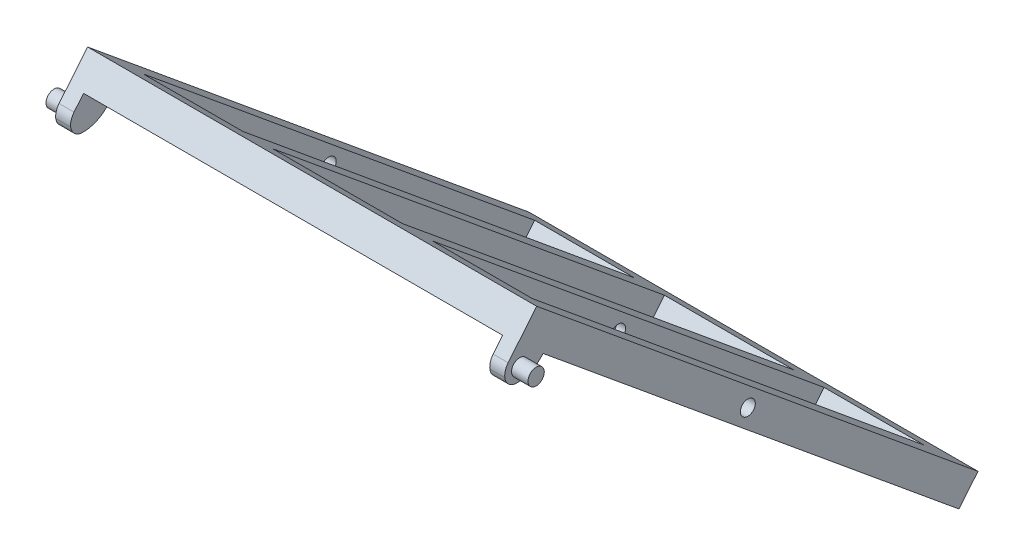
ISO-10303-21;
HEADER;
FILE_DESCRIPTION(('STEP AP214'),'2;1');
FILE_NAME('part.step','',(''),(''),'','','');
FILE_SCHEMA(('AUTOMOTIVE_DESIGN { 1 0 10303 214 1 1 1 1 }'));
ENDSEC;
DATA;
#1=APPLICATION_CONTEXT('core data for automotive mechanical design processes');
#2=APPLICATION_PROTOCOL_DEFINITION('international standard','automotive_design',2000,#1);
#3=PRODUCT_CONTEXT('',#1,'mechanical');
#4=PRODUCT('Part','Part','',(#3));
#5=PRODUCT_RELATED_PRODUCT_CATEGORY('part','',(#4));
#6=PRODUCT_DEFINITION_FORMATION('','',#4);
#7=PRODUCT_DEFINITION_CONTEXT('part definition',#1,'design');
#8=PRODUCT_DEFINITION('design','',#6,#7);
#9=PRODUCT_DEFINITION_SHAPE('','',#8);
#10=(LENGTH_UNIT() NAMED_UNIT(*) SI_UNIT(.MILLI.,.METRE.));
#11=(NAMED_UNIT(*) PLANE_ANGLE_UNIT() SI_UNIT($,.RADIAN.));
#12=(NAMED_UNIT(*) SI_UNIT($,.STERADIAN.) SOLID_ANGLE_UNIT());
#13=UNCERTAINTY_MEASURE_WITH_UNIT(LENGTH_MEASURE(1.E-05),#10,'distance_accuracy_value','');
#14=(GEOMETRIC_REPRESENTATION_CONTEXT(3) GLOBAL_UNCERTAINTY_ASSIGNED_CONTEXT((#13)) GLOBAL_UNIT_ASSIGNED_CONTEXT((#10,
#11,#12)) REPRESENTATION_CONTEXT('',''));
#15=CARTESIAN_POINT('',(0.,0.,0.));
#16=DIRECTION('',(0.,0.,1.));
#17=DIRECTION('',(1.,0.,0.));
#18=AXIS2_PLACEMENT_3D('',#15,#16,#17);
#19=CARTESIAN_POINT('',(-1555.33266545436,1.23088176075692,3828.30962572365));
#20=DIRECTION('',(0.,-0.63589091660457,-0.771778946447621));
#21=DIRECTION('',(0.,0.771778946447621,-0.63589091660457));
#22=AXIS2_PLACEMENT_3D('',#19,#20,#21);
#23=PLANE('',#22);
#24=DIRECTION('',(0.,0.771778946447621,-0.63589091660457));
#25=VECTOR('',#24,1.);
#26=CARTESIAN_POINT('',(-588.632665454366,-1386.77328942589,4971.92626456746));
#27=LINE('',#26,#25);
#28=CARTESIAN_POINT('',(-588.632665454354,-75.947012884002,3891.89871738411));
#29=VERTEX_POINT('',#28);
#30=CARTESIAN_POINT('',(-588.632665454366,1.23088176076047,3828.30962572365));
#31=VERTEX_POINT('',#30);
#32=EDGE_CURVE('E49',#29,#31,#27,.T.);
#33=ORIENTED_EDGE('',*,*,#32,.T.);
#34=DIRECTION('',(1.,0.,0.));
#35=VECTOR('',#34,1.);
#36=CARTESIAN_POINT('',(-1555.33266545436,1.23088176075692,3828.30962572365));
#37=LINE('',#36,#35);
#38=CARTESIAN_POINT('',(-255.332665454363,1.23088176076114,3828.30962572365));
#39=VERTEX_POINT('',#38);
#40=EDGE_CURVE('E222',#31,#39,#37,.T.);
#41=ORIENTED_EDGE('',*,*,#40,.T.);
#42=DIRECTION('',(0.,-0.771778946447621,0.63589091660457));
#43=VECTOR('',#42,1.);
#44=CARTESIAN_POINT('',(-255.332665454363,1.23088176076114,3828.30962572365));
#45=LINE('',#44,#43);
#46=CARTESIAN_POINT('',(-255.332665454363,-75.947012884001,3891.89871738411));
#47=VERTEX_POINT('',#46);
#48=EDGE_CURVE('E538',#39,#47,#45,.T.);
#49=ORIENTED_EDGE('',*,*,#48,.T.);
#50=DIRECTION('',(1.,0.,0.));
#51=VECTOR('',#50,1.);
#52=CARTESIAN_POINT('',(-1555.33266545436,-75.9470128840052,3891.89871738411));
#53=LINE('',#52,#51);
#54=EDGE_CURVE('E527',#29,#47,#53,.T.);
#55=ORIENTED_EDGE('',*,*,#54,.F.);
#56=EDGE_LOOP('',(#33,#41,#49,#55));
#57=FACE_BOUND('',#56,.T.);
#58=ADVANCED_FACE('F34',(#57),#23,.T.);
#59=CARTESIAN_POINT('',(-1555.33266545435,-1076.92306369262,2519.75733412393));
#60=DIRECTION('',(0.,0.63589091660457,0.771778946447621));
#61=DIRECTION('',(0.,-0.771778946447621,0.63589091660457));
#62=AXIS2_PLACEMENT_3D('',#59,#60,#61);
#63=PLANE('',#62);
#64=DIRECTION('',(0.,0.771778946447621,-0.63589091660457));
#65=VECTOR('',#64,1.);
#66=CARTESIAN_POINT('',(-588.632665454354,-2464.92723487927,3663.37397296775));
#67=LINE('',#66,#65);
#68=CARTESIAN_POINT('',(-588.632665454354,-1154.10095833738,2583.3464257844));
#69=VERTEX_POINT('',#68);
#70=CARTESIAN_POINT('',(-588.632665454354,-1076.92306369262,2519.75733412394));
#71=VERTEX_POINT('',#70);
#72=EDGE_CURVE('E204',#69,#71,#67,.T.);
#73=ORIENTED_EDGE('',*,*,#72,.F.);
#74=DIRECTION('',(-1.,0.,0.));
#75=VECTOR('',#74,1.);
#76=CARTESIAN_POINT('',(-1555.33266545435,-1154.10095833738,2583.34642578439));
#77=LINE('',#76,#75);
#78=CARTESIAN_POINT('',(-255.332665454354,-1154.10095833738,2583.34642578439));
#79=VERTEX_POINT('',#78);
#80=EDGE_CURVE('E250',#79,#69,#77,.T.);
#81=ORIENTED_EDGE('',*,*,#80,.F.);
#82=DIRECTION('',(0.,-0.771778946447621,0.63589091660457));
#83=VECTOR('',#82,1.);
#84=CARTESIAN_POINT('',(-255.332665454354,-1076.92306369262,2519.75733412394));
#85=LINE('',#84,#83);
#86=CARTESIAN_POINT('',(-255.332665454354,-1076.92306369262,2519.75733412394));
#87=VERTEX_POINT('',#86);
#88=EDGE_CURVE('E226',#87,#79,#85,.T.);
#89=ORIENTED_EDGE('',*,*,#88,.F.);
#90=DIRECTION('',(-1.,0.,0.));
#91=VECTOR('',#90,1.);
#92=CARTESIAN_POINT('',(-1555.33266545435,-1076.92306369262,2519.75733412393));
#93=LINE('',#92,#91);
#94=EDGE_CURVE('E221',#87,#71,#93,.T.);
#95=ORIENTED_EDGE('',*,*,#94,.T.);
#96=EDGE_LOOP('',(#73,#81,#89,#95));
#97=FACE_BOUND('',#96,.T.);
#98=ADVANCED_FACE('F225',(#97),#63,.T.);
#99=DIRECTION('',(0.,0.771778946447621,-0.63589091660457));
#100=VECTOR('',#99,1.);
#101=CARTESIAN_POINT('',(-1222.03266545437,-1386.77328942589,4971.92626456746));
#102=LINE('',#101,#100);
#103=CARTESIAN_POINT('',(-1222.03266545437,-75.9470128840036,3891.89871738411));
#104=VERTEX_POINT('',#103);
#105=CARTESIAN_POINT('',(-1222.03266545437,1.23088176075759,3828.30962572365));
#106=VERTEX_POINT('',#105);
#107=EDGE_CURVE('E288',#104,#106,#102,.T.);
#108=ORIENTED_EDGE('',*,*,#107,.F.);
#109=CARTESIAN_POINT('',(-1555.33266545436,-75.9470128840052,3891.89871738411));
#110=VERTEX_POINT('',#109);
#111=EDGE_CURVE('E526',#110,#104,#53,.T.);
#112=ORIENTED_EDGE('',*,*,#111,.F.);
#113=DIRECTION('',(0.,-0.771778946447621,0.63589091660457));
#114=VECTOR('',#113,1.);
#115=CARTESIAN_POINT('',(-1555.33266545436,1.23088176075692,3828.30962572365));
#116=LINE('',#115,#114);
#117=CARTESIAN_POINT('',(-1555.33266545436,1.23088176075692,3828.30962572365));
#118=VERTEX_POINT('',#117);
#119=EDGE_CURVE('E541',#118,#110,#116,.T.);
#120=ORIENTED_EDGE('',*,*,#119,.F.);
#121=EDGE_CURVE('E241',#118,#106,#37,.T.);
#122=ORIENTED_EDGE('',*,*,#121,.T.);
#123=EDGE_LOOP('',(#108,#112,#120,#122));
#124=FACE_BOUND('',#123,.T.);
#125=ADVANCED_FACE('F496',(#124),#23,.T.);
#126=DIRECTION('',(0.,0.771778946447621,-0.63589091660457));
#127=VECTOR('',#126,1.);
#128=CARTESIAN_POINT('',(-1222.03266545435,-2464.92723487927,3663.37397296774));
#129=LINE('',#128,#127);
#130=CARTESIAN_POINT('',(-1222.03266545437,-1154.10095833738,2583.34642578439));
#131=VERTEX_POINT('',#130);
#132=CARTESIAN_POINT('',(-1222.03266545435,-1076.92306369262,2519.75733412394));
#133=VERTEX_POINT('',#132);
#134=EDGE_CURVE('E297',#131,#133,#129,.T.);
#135=ORIENTED_EDGE('',*,*,#134,.T.);
#136=CARTESIAN_POINT('',(-1555.33266545435,-1076.92306369262,2519.75733412393));
#137=VERTEX_POINT('',#136);
#138=EDGE_CURVE('E231',#133,#137,#93,.T.);
#139=ORIENTED_EDGE('',*,*,#138,.T.);
#140=DIRECTION('',(0.,-0.771778946447621,0.63589091660457));
#141=VECTOR('',#140,1.);
#142=CARTESIAN_POINT('',(-1555.33266545435,-1076.92306369262,2519.75733412393));
#143=LINE('',#142,#141);
#144=CARTESIAN_POINT('',(-1555.33266545435,-1154.10095833738,2583.34642578439));
#145=VERTEX_POINT('',#144);
#146=EDGE_CURVE('E228',#137,#145,#143,.T.);
#147=ORIENTED_EDGE('',*,*,#146,.T.);
#148=EDGE_CURVE('E534',#131,#145,#77,.T.);
#149=ORIENTED_EDGE('',*,*,#148,.F.);
#150=EDGE_LOOP('',(#135,#139,#147,#149));
#151=FACE_BOUND('',#150,.T.);
#152=ADVANCED_FACE('F502',(#151),#63,.T.);
#153=CARTESIAN_POINT('',(0.,-1955.25360757669,1610.98979758281));
#154=DIRECTION('',(0.,0.771778946447621,-0.63589091660457));
#155=DIRECTION('',(0.,0.63589091660457,0.771778946447621));
#156=AXIS2_PLACEMENT_3D('',#153,#154,#155);
#157=PLANE('',#156);
#158=CARTESIAN_POINT('',(-1122.03266545435,-75.9470128840038,3891.89871738411));
#159=VERTEX_POINT('',#158);
#160=CARTESIAN_POINT('',(-688.632665454366,-75.9470128840014,3891.89871738411));
#161=VERTEX_POINT('',#160);
#162=EDGE_CURVE('E520',#159,#161,#53,.T.);
#163=ORIENTED_EDGE('',*,*,#162,.T.);
#164=DIRECTION('',(0.,-0.63589091660457,-0.771778946447621));
#165=VECTOR('',#164,1.);
#166=CARTESIAN_POINT('',(-688.632665454366,-75.9470128840012,3891.89871738411));
#167=LINE('',#166,#165);
#168=CARTESIAN_POINT('',(-688.632665454366,-1154.10095833738,2583.34642578439));
#169=VERTEX_POINT('',#168);
#170=EDGE_CURVE('E313',#161,#169,#167,.T.);
#171=ORIENTED_EDGE('',*,*,#170,.T.);
#172=CARTESIAN_POINT('',(-1122.03266545435,-1154.10095833738,2583.34642578439));
#173=VERTEX_POINT('',#172);
#174=EDGE_CURVE('E535',#169,#173,#77,.T.);
#175=ORIENTED_EDGE('',*,*,#174,.T.);
#176=DIRECTION('',(0.,0.63589091660457,0.771778946447621));
#177=VECTOR('',#176,1.);
#178=CARTESIAN_POINT('',(-1122.03266545437,-75.9470128840034,3891.89871738411));
#179=LINE('',#178,#177);
#180=EDGE_CURVE('E299',#173,#159,#179,.T.);
#181=ORIENTED_EDGE('',*,*,#180,.T.);
#182=EDGE_LOOP('',(#163,#171,#175,#181));
#183=FACE_BOUND('',#182,.T.);
#184=ORIENTED_EDGE('',*,*,#111,.T.);
#185=DIRECTION('',(0.,-0.63589091660457,-0.771778946447621));
#186=VECTOR('',#185,1.);
#187=CARTESIAN_POINT('',(-1222.03266545437,-75.9470128840036,3891.89871738411));
#188=LINE('',#187,#186);
#189=EDGE_CURVE('E285',#104,#131,#188,.T.);
#190=ORIENTED_EDGE('',*,*,#189,.T.);
#191=ORIENTED_EDGE('',*,*,#148,.T.);
#192=DIRECTION('',(0.,0.63589091660457,0.771778946447621));
#193=VECTOR('',#192,1.);
#194=CARTESIAN_POINT('',(-1555.33266545436,-75.9470128840052,3891.89871738411));
#195=LINE('',#194,#193);
#196=EDGE_CURVE('E254',#145,#110,#195,.T.);
#197=ORIENTED_EDGE('',*,*,#196,.T.);
#198=EDGE_LOOP('',(#184,#190,#191,#197));
#199=FACE_BOUND('',#198,.T.);
#200=DIRECTION('',(0.,0.63589091660457,0.771778946447621));
#201=VECTOR('',#200,1.);
#202=CARTESIAN_POINT('',(-588.632665454366,-75.9470128840007,3891.89871738411));
#203=LINE('',#202,#201);
#204=EDGE_CURVE('E208',#69,#29,#203,.T.);
#205=ORIENTED_EDGE('',*,*,#204,.T.);
#206=ORIENTED_EDGE('',*,*,#54,.T.);
#207=DIRECTION('',(0.,-0.63589091660457,-0.771778946447621));
#208=VECTOR('',#207,1.);
#209=CARTESIAN_POINT('',(-255.332665454363,-75.947012884001,3891.89871738411));
#210=LINE('',#209,#208);
#211=EDGE_CURVE('E530',#47,#79,#210,.T.);
#212=ORIENTED_EDGE('',*,*,#211,.T.);
#213=ORIENTED_EDGE('',*,*,#80,.T.);
#214=EDGE_LOOP('',(#205,#206,#212,#213));
#215=FACE_BOUND('',#214,.T.);
#216=DIRECTION('',(0.,0.63589091660457,0.771778946447621));
#217=VECTOR('',#216,1.);
#218=CARTESIAN_POINT('',(-205.332665454332,-147.041778674199,3805.61120799101));
#219=LINE('',#218,#217);
#220=CARTESIAN_POINT('',(-205.332665454332,-75.9470128840016,3891.8987173841));
#221=VERTEX_POINT('',#220);
#222=CARTESIAN_POINT('',(-205.332665454331,-5.99901205750308,3976.79440149333));
#223=VERTEX_POINT('',#222);
#224=EDGE_CURVE('E272',#221,#223,#219,.T.);
#225=ORIENTED_EDGE('',*,*,#224,.T.);
#226=DIRECTION('',(1.,0.,0.));
#227=VECTOR('',#226,1.);
#228=CARTESIAN_POINT('',(-1655.33266545437,-5.99901205750908,3976.79440149334));
#229=LINE('',#228,#227);
#230=CARTESIAN_POINT('',(-1605.33266545437,-5.99901205750891,3976.79440149334));
#231=VERTEX_POINT('',#230);
#232=EDGE_CURVE('E437',#231,#223,#229,.T.);
#233=ORIENTED_EDGE('',*,*,#232,.F.);
#234=DIRECTION('',(0.,0.63589091660457,0.771778946447621));
#235=VECTOR('',#234,1.);
#236=CARTESIAN_POINT('',(-1605.33266545437,-147.041778674199,3805.61120799101));
#237=LINE('',#236,#235);
#238=CARTESIAN_POINT('',(-1605.33266545436,-75.9470128840063,3891.8987173841));
#239=VERTEX_POINT('',#238);
#240=EDGE_CURVE('E259',#239,#231,#237,.T.);
#241=ORIENTED_EDGE('',*,*,#240,.F.);
#242=DIRECTION('',(-1.,-1.19367772865983E-13,0.));
#243=VECTOR('',#242,1.);
#244=CARTESIAN_POINT('',(-1655.33266545437,-75.9470128840074,3891.8987173841));
#245=LINE('',#244,#243);
#246=CARTESIAN_POINT('',(-1655.33266545436,-75.9470128840063,3891.8987173841));
#247=VERTEX_POINT('',#246);
#248=EDGE_CURVE('E255',#239,#247,#245,.T.);
#249=ORIENTED_EDGE('',*,*,#248,.T.);
#250=DIRECTION('',(0.,0.63589091660457,0.771778946447621));
#251=VECTOR('',#250,1.);
#252=CARTESIAN_POINT('',(-1655.33266545436,-1220.55066277223,2502.69661377839));
#253=LINE('',#252,#251);
#254=CARTESIAN_POINT('',(-1655.33266545436,-1220.55066277223,2502.69661377839));
#255=VERTEX_POINT('',#254);
#256=EDGE_CURVE('E448',#255,#247,#253,.T.);
#257=ORIENTED_EDGE('',*,*,#256,.F.);
#258=DIRECTION('',(-1.,0.,0.));
#259=VECTOR('',#258,1.);
#260=CARTESIAN_POINT('',(-1655.33266545436,-1220.55066277223,2502.69661377839));
#261=LINE('',#260,#259);
#262=CARTESIAN_POINT('',(-155.332665454353,-1220.55066277223,2502.69661377839));
#263=VERTEX_POINT('',#262);
#264=EDGE_CURVE('E436',#263,#255,#261,.T.);
#265=ORIENTED_EDGE('',*,*,#264,.F.);
#266=DIRECTION('',(0.,-0.63589091660457,-0.771778946447621));
#267=VECTOR('',#266,1.);
#268=CARTESIAN_POINT('',(-155.332665454353,-1220.55066277223,2502.69661377839));
#269=LINE('',#268,#267);
#270=CARTESIAN_POINT('',(-155.332665454362,-75.9470128840067,3891.8987173841));
#271=VERTEX_POINT('',#270);
#272=EDGE_CURVE('E430',#271,#263,#269,.T.);
#273=ORIENTED_EDGE('',*,*,#272,.F.);
#274=DIRECTION('',(1.,-1.19367773271786E-13,0.));
#275=VECTOR('',#274,1.);
#276=CARTESIAN_POINT('',(-155.332665454332,-75.9470128840074,3891.8987173841));
#277=LINE('',#276,#275);
#278=EDGE_CURVE('E271',#221,#271,#277,.T.);
#279=ORIENTED_EDGE('',*,*,#278,.F.);
#280=EDGE_LOOP('',(#225,#233,#241,#249,#257,#265,#273,#279));
#281=FACE_BOUND('',#280,.T.);
#282=ADVANCED_FACE('F447',(#183,#199,#215,#281),#157,.F.);
#283=CARTESIAN_POINT('',(0.,-1878.07571293192,1547.40070592236));
#284=DIRECTION('',(0.,0.771778946447621,-0.63589091660457));
#285=DIRECTION('',(0.,0.63589091660457,0.771778946447621));
#286=AXIS2_PLACEMENT_3D('',#283,#284,#285);
#287=PLANE('',#286);
#288=ORIENTED_EDGE('',*,*,#40,.F.);
#289=DIRECTION('',(0.,-0.63589091660457,-0.771778946447621));
#290=VECTOR('',#289,1.);
#291=CARTESIAN_POINT('',(-588.632665454366,1.23088176076047,3828.30962572365));
#292=LINE('',#291,#290);
#293=EDGE_CURVE('E207',#31,#71,#292,.T.);
#294=ORIENTED_EDGE('',*,*,#293,.T.);
#295=ORIENTED_EDGE('',*,*,#94,.F.);
#296=DIRECTION('',(0.,-0.63589091660457,-0.771778946447621));
#297=VECTOR('',#296,1.);
#298=CARTESIAN_POINT('',(-255.332665454363,1.23088176076114,3828.30962572365));
#299=LINE('',#298,#297);
#300=EDGE_CURVE('E236',#39,#87,#299,.T.);
#301=ORIENTED_EDGE('',*,*,#300,.F.);
#302=EDGE_LOOP('',(#288,#294,#295,#301));
#303=FACE_BOUND('',#302,.T.);
#304=CARTESIAN_POINT('',(-1122.03266545437,1.23088176075803,3828.30962572365));
#305=VERTEX_POINT('',#304);
#306=CARTESIAN_POINT('',(-688.632665454366,1.23088176076003,3828.30962572365));
#307=VERTEX_POINT('',#306);
#308=EDGE_CURVE('E245',#305,#307,#37,.T.);
#309=ORIENTED_EDGE('',*,*,#308,.F.);
#310=DIRECTION('',(0.,-0.63589091660457,-0.771778946447621));
#311=VECTOR('',#310,1.);
#312=CARTESIAN_POINT('',(-1122.03266545437,1.23088176075803,3828.30962572365));
#313=LINE('',#312,#311);
#314=CARTESIAN_POINT('',(-1122.03266545435,-1076.92306369262,2519.75733412394));
#315=VERTEX_POINT('',#314);
#316=EDGE_CURVE('E291',#305,#315,#313,.T.);
#317=ORIENTED_EDGE('',*,*,#316,.T.);
#318=CARTESIAN_POINT('',(-688.632665454354,-1076.92306369262,2519.75733412394));
#319=VERTEX_POINT('',#318);
#320=EDGE_CURVE('E229',#319,#315,#93,.T.);
#321=ORIENTED_EDGE('',*,*,#320,.F.);
#322=DIRECTION('',(0.,0.63589091660457,0.771778946447621));
#323=VECTOR('',#322,1.);
#324=CARTESIAN_POINT('',(-688.632665454366,1.23088176076003,3828.30962572365));
#325=LINE('',#324,#323);
#326=EDGE_CURVE('E213',#319,#307,#325,.T.);
#327=ORIENTED_EDGE('',*,*,#326,.T.);
#328=EDGE_LOOP('',(#309,#317,#321,#327));
#329=FACE_BOUND('',#328,.T.);
#330=DIRECTION('',(0.,0.63589091660457,0.771778946447621));
#331=VECTOR('',#330,1.);
#332=CARTESIAN_POINT('',(-1655.33266545436,-1143.37276812747,2439.10752211793));
#333=LINE('',#332,#331);
#334=CARTESIAN_POINT('',(-1655.33266545436,-1143.37276812747,2439.10752211793));
#335=VERTEX_POINT('',#334);
#336=CARTESIAN_POINT('',(-1655.33266545437,71.178882587253,3913.20530983288));
#337=VERTEX_POINT('',#336);
#338=EDGE_CURVE('E449',#335,#337,#333,.T.);
#339=ORIENTED_EDGE('',*,*,#338,.T.);
#340=DIRECTION('',(1.,0.,0.));
#341=VECTOR('',#340,1.);
#342=CARTESIAN_POINT('',(-1655.33266545437,71.178882587253,3913.20530983288));
#343=LINE('',#342,#341);
#344=CARTESIAN_POINT('',(-155.332665454363,71.1788825872581,3913.20530983289));
#345=VERTEX_POINT('',#344);
#346=EDGE_CURVE('E452',#337,#345,#343,.T.);
#347=ORIENTED_EDGE('',*,*,#346,.T.);
#348=DIRECTION('',(0.,-0.63589091660457,-0.771778946447621));
#349=VECTOR('',#348,1.);
#350=CARTESIAN_POINT('',(-155.332665454353,-1143.37276812747,2439.10752211794));
#351=LINE('',#350,#349);
#352=CARTESIAN_POINT('',(-155.332665454353,-1143.37276812747,2439.10752211794));
#353=VERTEX_POINT('',#352);
#354=EDGE_CURVE('E545',#345,#353,#351,.T.);
#355=ORIENTED_EDGE('',*,*,#354,.T.);
#356=DIRECTION('',(-1.,0.,0.));
#357=VECTOR('',#356,1.);
#358=CARTESIAN_POINT('',(-1655.33266545436,-1143.37276812747,2439.10752211793));
#359=LINE('',#358,#357);
#360=EDGE_CURVE('E443',#353,#335,#359,.T.);
#361=ORIENTED_EDGE('',*,*,#360,.T.);
#362=EDGE_LOOP('',(#339,#347,#355,#361));
#363=FACE_BOUND('',#362,.T.);
#364=ORIENTED_EDGE('',*,*,#121,.F.);
#365=DIRECTION('',(0.,0.63589091660457,0.771778946447621));
#366=VECTOR('',#365,1.);
#367=CARTESIAN_POINT('',(-1555.33266545436,1.23088176075692,3828.30962572365));
#368=LINE('',#367,#366);
#369=EDGE_CURVE('E248',#137,#118,#368,.T.);
#370=ORIENTED_EDGE('',*,*,#369,.F.);
#371=ORIENTED_EDGE('',*,*,#138,.F.);
#372=DIRECTION('',(0.,0.63589091660457,0.771778946447621));
#373=VECTOR('',#372,1.);
#374=CARTESIAN_POINT('',(-1222.03266545437,1.23088176075759,3828.30962572365));
#375=LINE('',#374,#373);
#376=EDGE_CURVE('E302',#133,#106,#375,.T.);
#377=ORIENTED_EDGE('',*,*,#376,.T.);
#378=EDGE_LOOP('',(#364,#370,#371,#377));
#379=FACE_BOUND('',#378,.T.);
#380=ADVANCED_FACE('F218',(#303,#329,#363,#379),#287,.T.);
#381=CARTESIAN_POINT('',(-1655.33266545436,-1143.37276812747,2439.10752211793));
#382=DIRECTION('',(1.,0.,0.));
#383=DIRECTION('',(0.,0.,-1.));
#384=AXIS2_PLACEMENT_3D('',#381,#382,#383);
#385=PLANE('',#384);
#386=CARTESIAN_POINT('',(-1655.33266545437,-574.685890092493,3207.95096180563));
#387=DIRECTION('',(1.,0.,0.));
#388=DIRECTION('',(0.,0.,-1.));
#389=AXIS2_PLACEMENT_3D('',#386,#387,#388);
#390=CIRCLE('',#389,25.0000000000005);
#391=CARTESIAN_POINT('',(-1655.33266545437,-574.685890092493,3182.95096180563));
#392=VERTEX_POINT('',#391);
#393=EDGE_CURVE('E333',#392,#392,#390,.F.);
#394=ORIENTED_EDGE('',*,*,#393,.F.);
#395=EDGE_LOOP('',(#394));
#396=FACE_BOUND('',#395,.T.);
#397=CARTESIAN_POINT('',(-1655.33266545437,-76.3825052101136,3970.00000000119));
#398=DIRECTION('',(1.,0.,0.));
#399=DIRECTION('',(0.,0.,-1.));
#400=AXIS2_PLACEMENT_3D('',#397,#398,#399);
#401=CIRCLE('',#400,27.1844999985782);
#402=CARTESIAN_POINT('',(-1655.33266545437,-76.3825052101136,3942.81550000261));
#403=VERTEX_POINT('',#402);
#404=EDGE_CURVE('E360',#403,#403,#401,.F.);
#405=ORIENTED_EDGE('',*,*,#404,.F.);
#406=EDGE_LOOP('',(#405));
#407=FACE_BOUND('',#406,.T.);
#408=CARTESIAN_POINT('',(-1655.33266545437,-7.55832218157994,3978.0791620438));
#409=DIRECTION('',(1.,0.,0.));
#410=DIRECTION('',(0.,0.,-1.));
#411=AXIS2_PLACEMENT_3D('',#408,#409,#410);
#412=CIRCLE('',#411,110.);
#413=CARTESIAN_POINT('',(-1655.33266545437,-77.5063230080827,3893.18347793456));
#414=VERTEX_POINT('',#413);
#415=CARTESIAN_POINT('',(-1655.33266545437,-117.519718806445,3980.99313738842));
#416=VERTEX_POINT('',#415);
#417=EDGE_CURVE('E363',#414,#416,#412,.F.);
#418=ORIENTED_EDGE('',*,*,#417,.T.);
#419=CARTESIAN_POINT('',(-1655.33266545437,-77.5337563974032,3979.93350999038));
#420=DIRECTION('',(1.,0.,0.));
#421=DIRECTION('',(0.,0.,-1.));
#422=AXIS2_PLACEMENT_3D('',#419,#420,#421);
#423=CIRCLE('',#422,40.);
#424=CARTESIAN_POINT('',(-1655.33266545437,-82.1387611461862,4019.66754994687));
#425=VERTEX_POINT('',#424);
#426=EDGE_CURVE('E364',#416,#425,#423,.F.);
#427=ORIENTED_EDGE('',*,*,#426,.T.);
#428=CARTESIAN_POINT('',(-1655.33266545437,-76.3825052102075,3970.00000000126));
#429=DIRECTION('',(1.,0.,0.));
#430=DIRECTION('',(0.,0.,-1.));
#431=AXIS2_PLACEMENT_3D('',#428,#429,#430);
#432=CIRCLE('',#431,50.);
#433=CARTESIAN_POINT('',(-1655.33266545437,-44.5879593799789,4008.58894732364));
#434=VERTEX_POINT('',#433);
#435=EDGE_CURVE('E468',#425,#434,#432,.F.);
#436=ORIENTED_EDGE('',*,*,#435,.T.);
#437=DIRECTION('',(0.,-0.771778946447621,0.63589091660457));
#438=VECTOR('',#437,1.);
#439=CARTESIAN_POINT('',(-1655.33266545437,71.178882587253,3913.20530983288));
#440=LINE('',#439,#438);
#441=EDGE_CURVE('E458',#337,#434,#440,.T.);
#442=ORIENTED_EDGE('',*,*,#441,.F.);
#443=ORIENTED_EDGE('',*,*,#338,.F.);
#444=DIRECTION('',(0.,-0.771778946447621,0.63589091660457));
#445=VECTOR('',#444,1.);
#446=CARTESIAN_POINT('',(-1655.33266545436,-1143.37276812747,2439.10752211793));
#447=LINE('',#446,#445);
#448=EDGE_CURVE('E444',#335,#255,#447,.T.);
#449=ORIENTED_EDGE('',*,*,#448,.T.);
#450=ORIENTED_EDGE('',*,*,#256,.T.);
#451=DIRECTION('',(1.53210777398096E-13,-0.771778946447619,0.635890916604572));
#452=VECTOR('',#451,1.);
#453=CARTESIAN_POINT('',(-1655.33266545437,-75.9470128840072,3891.8987173841));
#454=LINE('',#453,#452);
#455=EDGE_CURVE('E251',#247,#414,#454,.T.);
#456=ORIENTED_EDGE('',*,*,#455,.T.);
#457=EDGE_LOOP('',(#418,#427,#436,#442,#443,#449,#450,#456));
#458=FACE_BOUND('',#457,.T.);
#459=ADVANCED_FACE('F352',(#396,#407,#458),#385,.F.);
#460=CARTESIAN_POINT('',(-1655.33266545437,71.178882587253,3913.20530983288));
#461=DIRECTION('',(0.,-0.63589091660457,-0.771778946447621));
#462=DIRECTION('',(0.,0.771778946447621,-0.63589091660457));
#463=AXIS2_PLACEMENT_3D('',#460,#461,#462);
#464=PLANE('',#463);
#465=DIRECTION('',(1.55431223447344E-13,0.771778946447619,-0.635890916604572));
#466=VECTOR('',#465,1.);
#467=CARTESIAN_POINT('',(-205.332665454331,-5.99901205750308,3976.79440149333));
#468=LINE('',#467,#466);
#469=CARTESIAN_POINT('',(-205.332665454339,-44.5879593799727,4008.58894732363));
#470=VERTEX_POINT('',#469);
#471=EDGE_CURVE('E275',#470,#223,#468,.T.);
#472=ORIENTED_EDGE('',*,*,#471,.F.);
#473=DIRECTION('',(-1.,1.14243213007894E-13,-1.01078325528293E-13));
#474=VECTOR('',#473,1.);
#475=CARTESIAN_POINT('',(-1655.3326654544,-44.5879593798029,4008.58894732349));
#476=LINE('',#475,#474);
#477=CARTESIAN_POINT('',(-155.332665454363,-44.5879593799744,4008.58894732364));
#478=VERTEX_POINT('',#477);
#479=EDGE_CURVE('E385',#470,#478,#476,.F.);
#480=ORIENTED_EDGE('',*,*,#479,.T.);
#481=DIRECTION('',(0.,-0.771778946447621,0.63589091660457));
#482=VECTOR('',#481,1.);
#483=CARTESIAN_POINT('',(-155.332665454363,71.1788825872581,3913.20530983289));
#484=LINE('',#483,#482);
#485=EDGE_CURVE('E416',#345,#478,#484,.T.);
#486=ORIENTED_EDGE('',*,*,#485,.F.);
#487=ORIENTED_EDGE('',*,*,#346,.F.);
#488=ORIENTED_EDGE('',*,*,#441,.T.);
#489=DIRECTION('',(1.,1.21064926316707E-13,0.));
#490=VECTOR('',#489,1.);
#491=CARTESIAN_POINT('',(-1605.33266545436,-44.5879593799732,4008.58894732363));
#492=LINE('',#491,#490);
#493=CARTESIAN_POINT('',(-1605.33266545436,-44.5879593799724,4008.58894732363));
#494=VERTEX_POINT('',#493);
#495=EDGE_CURVE('E462',#434,#494,#492,.T.);
#496=ORIENTED_EDGE('',*,*,#495,.T.);
#497=DIRECTION('',(-1.55431223447344E-13,0.771778946447619,-0.635890916604572));
#498=VECTOR('',#497,1.);
#499=CARTESIAN_POINT('',(-1605.33266545437,-5.99901205750308,3976.79440149333));
#500=LINE('',#499,#498);
#501=EDGE_CURVE('E262',#494,#231,#500,.T.);
#502=ORIENTED_EDGE('',*,*,#501,.T.);
#503=ORIENTED_EDGE('',*,*,#232,.T.);
#504=EDGE_LOOP('',(#472,#480,#486,#487,#488,#496,#502,#503));
#505=FACE_BOUND('',#504,.T.);
#506=ADVANCED_FACE('F355',(#505),#464,.F.);
#507=CARTESIAN_POINT('',(-155.332665454353,-1143.37276812747,2439.10752211794));
#508=DIRECTION('',(-1.,0.,0.));
#509=DIRECTION('',(0.,0.,1.));
#510=AXIS2_PLACEMENT_3D('',#507,#508,#509);
#511=PLANE('',#510);
#512=CARTESIAN_POINT('',(-155.332665454358,-574.685890092493,3207.95096180563));
#513=DIRECTION('',(-1.,0.,0.));
#514=DIRECTION('',(0.,0.,1.));
#515=AXIS2_PLACEMENT_3D('',#512,#513,#514);
#516=CIRCLE('',#515,25.0000000000005);
#517=CARTESIAN_POINT('',(-155.332665454358,-574.685890092493,3232.95096180563));
#518=VERTEX_POINT('',#517);
#519=EDGE_CURVE('E321',#518,#518,#516,.T.);
#520=ORIENTED_EDGE('',*,*,#519,.T.);
#521=EDGE_LOOP('',(#520));
#522=FACE_BOUND('',#521,.T.);
#523=CARTESIAN_POINT('',(-155.332665454347,-76.3825052101136,3970.00000000119));
#524=DIRECTION('',(-1.,0.,0.));
#525=DIRECTION('',(0.,0.,1.));
#526=AXIS2_PLACEMENT_3D('',#523,#524,#525);
#527=CIRCLE('',#526,27.1844999985782);
#528=CARTESIAN_POINT('',(-155.332665454347,-76.3825052101136,3997.18449999977));
#529=VERTEX_POINT('',#528);
#530=EDGE_CURVE('E282',#529,#529,#527,.T.);
#531=ORIENTED_EDGE('',*,*,#530,.T.);
#532=EDGE_LOOP('',(#531));
#533=FACE_BOUND('',#532,.T.);
#534=CARTESIAN_POINT('',(-155.332665454362,-76.3825052102024,3970.00000000126));
#535=DIRECTION('',(-1.,0.,0.));
#536=DIRECTION('',(0.,0.,1.));
#537=AXIS2_PLACEMENT_3D('',#534,#535,#536);
#538=CIRCLE('',#537,50.);
#539=CARTESIAN_POINT('',(-155.332665454363,-82.1387611461898,4019.66754994687));
#540=VERTEX_POINT('',#539);
#541=EDGE_CURVE('E387',#478,#540,#538,.F.);
#542=ORIENTED_EDGE('',*,*,#541,.T.);
#543=CARTESIAN_POINT('',(-155.332665454362,-77.5337563973999,3979.93350999039));
#544=DIRECTION('',(-1.,0.,0.));
#545=DIRECTION('',(0.,0.,1.));
#546=AXIS2_PLACEMENT_3D('',#543,#544,#545);
#547=CIRCLE('',#546,40.);
#548=CARTESIAN_POINT('',(-155.332665454362,-117.519718806442,3980.99313738844));
#549=VERTEX_POINT('',#548);
#550=EDGE_CURVE('E11',#540,#549,#547,.F.);
#551=ORIENTED_EDGE('',*,*,#550,.T.);
#552=CARTESIAN_POINT('',(-155.332665454363,-7.55832218157677,3978.0791620438));
#553=DIRECTION('',(-1.,0.,0.));
#554=DIRECTION('',(0.,0.,1.));
#555=AXIS2_PLACEMENT_3D('',#552,#553,#554);
#556=CIRCLE('',#555,110.);
#557=CARTESIAN_POINT('',(-155.332665454362,-77.5063230080795,3893.18347793456));
#558=VERTEX_POINT('',#557);
#559=EDGE_CURVE('E396',#549,#558,#556,.F.);
#560=ORIENTED_EDGE('',*,*,#559,.T.);
#561=DIRECTION('',(-1.53210777398096E-13,-0.771778946447619,0.635890916604572));
#562=VECTOR('',#561,1.);
#563=CARTESIAN_POINT('',(-155.332665454332,-75.9470128840072,3891.8987173841));
#564=LINE('',#563,#562);
#565=EDGE_CURVE('E268',#271,#558,#564,.T.);
#566=ORIENTED_EDGE('',*,*,#565,.F.);
#567=ORIENTED_EDGE('',*,*,#272,.T.);
#568=DIRECTION('',(0.,-0.771778946447621,0.63589091660457));
#569=VECTOR('',#568,1.);
#570=CARTESIAN_POINT('',(-155.332665454353,-1143.37276812747,2439.10752211794));
#571=LINE('',#570,#569);
#572=EDGE_CURVE('E432',#353,#263,#571,.T.);
#573=ORIENTED_EDGE('',*,*,#572,.F.);
#574=ORIENTED_EDGE('',*,*,#354,.F.);
#575=ORIENTED_EDGE('',*,*,#485,.T.);
#576=EDGE_LOOP('',(#542,#551,#560,#566,#567,#573,#574,#575));
#577=FACE_BOUND('',#576,.T.);
#578=ADVANCED_FACE('F412',(#522,#533,#577),#511,.F.);
#579=CARTESIAN_POINT('',(-1655.33266545436,-1143.37276812747,2439.10752211793));
#580=DIRECTION('',(0.,0.63589091660457,0.771778946447621));
#581=DIRECTION('',(0.,-0.771778946447621,0.63589091660457));
#582=AXIS2_PLACEMENT_3D('',#579,#580,#581);
#583=PLANE('',#582);
#584=ORIENTED_EDGE('',*,*,#264,.T.);
#585=ORIENTED_EDGE('',*,*,#448,.F.);
#586=ORIENTED_EDGE('',*,*,#360,.F.);
#587=ORIENTED_EDGE('',*,*,#572,.T.);
#588=EDGE_LOOP('',(#584,#585,#586,#587));
#589=FACE_BOUND('',#588,.T.);
#590=ADVANCED_FACE('F440',(#589),#583,.F.);
#591=CARTESIAN_POINT('',(-1555.33266545436,1.23088176075692,3828.30962572365));
#592=DIRECTION('',(1.,0.,0.));
#593=DIRECTION('',(0.,0.,-1.));
#594=AXIS2_PLACEMENT_3D('',#591,#592,#593);
#595=PLANE('',#594);
#596=CARTESIAN_POINT('',(-1555.33266545436,-574.685890092493,3207.95096180563));
#597=DIRECTION('',(-1.,0.,0.));
#598=DIRECTION('',(0.,0.,1.));
#599=AXIS2_PLACEMENT_3D('',#596,#597,#598);
#600=CIRCLE('',#599,25.0000000000005);
#601=CARTESIAN_POINT('',(-1555.33266545436,-574.685890092493,3232.95096180563));
#602=VERTEX_POINT('',#601);
#603=EDGE_CURVE('E338',#602,#602,#600,.T.);
#604=ORIENTED_EDGE('',*,*,#603,.T.);
#605=EDGE_LOOP('',(#604));
#606=FACE_BOUND('',#605,.T.);
#607=ORIENTED_EDGE('',*,*,#196,.F.);
#608=ORIENTED_EDGE('',*,*,#146,.F.);
#609=ORIENTED_EDGE('',*,*,#369,.T.);
#610=ORIENTED_EDGE('',*,*,#119,.T.);
#611=EDGE_LOOP('',(#607,#608,#609,#610));
#612=FACE_BOUND('',#611,.T.);
#613=ADVANCED_FACE('F342',(#606,#612),#595,.T.);
#614=DIRECTION('',(0.,0.771778946447621,-0.63589091660457));
#615=VECTOR('',#614,1.);
#616=CARTESIAN_POINT('',(-688.632665454366,-1386.77328942589,4971.92626456746));
#617=LINE('',#616,#615);
#618=EDGE_CURVE('E310',#161,#307,#617,.T.);
#619=ORIENTED_EDGE('',*,*,#618,.F.);
#620=ORIENTED_EDGE('',*,*,#162,.F.);
#621=DIRECTION('',(0.,0.771778946447621,-0.63589091660457));
#622=VECTOR('',#621,1.);
#623=CARTESIAN_POINT('',(-1122.03266545437,-1386.77328942589,4971.92626456746));
#624=LINE('',#623,#622);
#625=EDGE_CURVE('E290',#159,#305,#624,.T.);
#626=ORIENTED_EDGE('',*,*,#625,.T.);
#627=ORIENTED_EDGE('',*,*,#308,.T.);
#628=EDGE_LOOP('',(#619,#620,#626,#627));
#629=FACE_BOUND('',#628,.T.);
#630=ADVANCED_FACE('F497',(#629),#23,.T.);
#631=CARTESIAN_POINT('',(-255.332665454363,1.23088176076114,3828.30962572365));
#632=DIRECTION('',(-1.,0.,0.));
#633=DIRECTION('',(0.,0.,1.));
#634=AXIS2_PLACEMENT_3D('',#631,#632,#633);
#635=PLANE('',#634);
#636=CARTESIAN_POINT('',(-255.332665454347,-574.685890092493,3207.95096180563));
#637=DIRECTION('',(-1.,0.,0.));
#638=DIRECTION('',(0.,0.,1.));
#639=AXIS2_PLACEMENT_3D('',#636,#637,#638);
#640=CIRCLE('',#639,25.0000000000005);
#641=CARTESIAN_POINT('',(-255.332665454347,-574.685890092493,3232.95096180563));
#642=VERTEX_POINT('',#641);
#643=EDGE_CURVE('E326',#642,#642,#640,.T.);
#644=ORIENTED_EDGE('',*,*,#643,.F.);
#645=EDGE_LOOP('',(#644));
#646=FACE_BOUND('',#645,.T.);
#647=ORIENTED_EDGE('',*,*,#211,.F.);
#648=ORIENTED_EDGE('',*,*,#48,.F.);
#649=ORIENTED_EDGE('',*,*,#300,.T.);
#650=ORIENTED_EDGE('',*,*,#88,.T.);
#651=EDGE_LOOP('',(#647,#648,#649,#650));
#652=FACE_BOUND('',#651,.T.);
#653=ADVANCED_FACE('F509',(#646,#652),#635,.T.);
#654=DIRECTION('',(0.,0.771778946447621,-0.63589091660457));
#655=VECTOR('',#654,1.);
#656=CARTESIAN_POINT('',(-688.632665454354,-2464.92723487927,3663.37397296775));
#657=LINE('',#656,#655);
#658=EDGE_CURVE('E57',#169,#319,#657,.T.);
#659=ORIENTED_EDGE('',*,*,#658,.T.);
#660=ORIENTED_EDGE('',*,*,#320,.T.);
#661=DIRECTION('',(0.,0.771778946447621,-0.63589091660457));
#662=VECTOR('',#661,1.);
#663=CARTESIAN_POINT('',(-1122.03266545435,-2464.92723487927,3663.37397296774));
#664=LINE('',#663,#662);
#665=EDGE_CURVE('E294',#173,#315,#664,.T.);
#666=ORIENTED_EDGE('',*,*,#665,.F.);
#667=ORIENTED_EDGE('',*,*,#174,.F.);
#668=EDGE_LOOP('',(#659,#660,#666,#667));
#669=FACE_BOUND('',#668,.T.);
#670=ADVANCED_FACE('F503',(#669),#63,.T.);
#671=CARTESIAN_POINT('',(-1605.33266545437,-147.041778674199,3805.61120799101));
#672=DIRECTION('',(1.,1.23369402531662E-13,0.));
#673=DIRECTION('',(-1.23369402531662E-13,1.,0.));
#674=AXIS2_PLACEMENT_3D('',#671,#672,#673);
#675=PLANE('',#674);
#676=CARTESIAN_POINT('',(-1605.33266545436,-76.3825052102014,3970.00000000125));
#677=DIRECTION('',(1.,1.23369402531662E-13,0.));
#678=DIRECTION('',(-1.23369402531662E-13,1.,0.));
#679=AXIS2_PLACEMENT_3D('',#676,#677,#678);
#680=CIRCLE('',#679,50.);
#681=CARTESIAN_POINT('',(-1605.33266545436,-82.1387611461802,4019.66754994686));
#682=VERTEX_POINT('',#681);
#683=EDGE_CURVE('E465',#494,#682,#680,.T.);
#684=ORIENTED_EDGE('',*,*,#683,.T.);
#685=CARTESIAN_POINT('',(-1605.33266545436,-77.5337563973972,3979.93350999037));
#686=DIRECTION('',(1.,1.23369402531662E-13,0.));
#687=DIRECTION('',(-1.23369402531662E-13,1.,0.));
#688=AXIS2_PLACEMENT_3D('',#685,#686,#687);
#689=CIRCLE('',#688,40.);
#690=CARTESIAN_POINT('',(-1605.33266545436,-117.519718806439,3980.99313738842));
#691=VERTEX_POINT('',#690);
#692=EDGE_CURVE('E381',#682,#691,#689,.T.);
#693=ORIENTED_EDGE('',*,*,#692,.T.);
#694=CARTESIAN_POINT('',(-1605.33266545437,-7.55832218157388,3978.07916204379));
#695=DIRECTION('',(1.,1.23369402531662E-13,0.));
#696=DIRECTION('',(-1.23369402531662E-13,1.,0.));
#697=AXIS2_PLACEMENT_3D('',#694,#695,#696);
#698=CIRCLE('',#697,110.);
#699=CARTESIAN_POINT('',(-1605.33266545437,-77.5063230080767,3893.18347793456));
#700=VERTEX_POINT('',#699);
#701=EDGE_CURVE('E374',#691,#700,#698,.T.);
#702=ORIENTED_EDGE('',*,*,#701,.T.);
#703=DIRECTION('',(-1.55431223447344E-13,0.771778946447619,-0.635890916604572));
#704=VECTOR('',#703,1.);
#705=CARTESIAN_POINT('',(-1605.33266545437,-75.9470128840012,3891.8987173841));
#706=LINE('',#705,#704);
#707=EDGE_CURVE('E258',#700,#239,#706,.T.);
#708=ORIENTED_EDGE('',*,*,#707,.T.);
#709=ORIENTED_EDGE('',*,*,#240,.T.);
#710=ORIENTED_EDGE('',*,*,#501,.F.);
#711=EDGE_LOOP('',(#684,#693,#702,#708,#709,#710));
#712=FACE_BOUND('',#711,.T.);
#713=ADVANCED_FACE('F472',(#712),#675,.T.);
#714=CARTESIAN_POINT('',(-1655.33266545436,-153.124907528768,3955.48780904456));
#715=DIRECTION('',(0.,-0.635890916604572,-0.771778946447619));
#716=DIRECTION('',(0.,0.771778946447619,-0.635890916604572));
#717=AXIS2_PLACEMENT_3D('',#714,#715,#716);
#718=PLANE('',#717);
#719=ORIENTED_EDGE('',*,*,#707,.F.);
#720=DIRECTION('',(-1.,-1.17654069459399E-13,0.));
#721=VECTOR('',#720,1.);
#722=CARTESIAN_POINT('',(-1655.33266545438,-77.5063230080827,3893.18347793456));
#723=LINE('',#722,#721);
#724=EDGE_CURVE('E371',#700,#414,#723,.T.);
#725=ORIENTED_EDGE('',*,*,#724,.T.);
#726=ORIENTED_EDGE('',*,*,#455,.F.);
#727=ORIENTED_EDGE('',*,*,#248,.F.);
#728=EDGE_LOOP('',(#719,#725,#726,#727));
#729=FACE_BOUND('',#728,.T.);
#730=ADVANCED_FACE('F477',(#729),#718,.T.);
#731=CARTESIAN_POINT('',(-1710.33266545436,-76.3825052101136,3970.00000000119));
#732=DIRECTION('',(1.,0.,0.));
#733=DIRECTION('',(0.,0.,-1.));
#734=AXIS2_PLACEMENT_3D('',#731,#732,#733);
#735=CYLINDRICAL_SURFACE('',#734,27.1844999985782);
#736=CARTESIAN_POINT('',(-1710.33266545436,-76.3825052101136,3970.00000000119));
#737=DIRECTION('',(-1.,0.,0.));
#738=DIRECTION('',(0.,0.,1.));
#739=AXIS2_PLACEMENT_3D('',#736,#737,#738);
#740=CIRCLE('',#739,27.1844999985782);
#741=CARTESIAN_POINT('',(-1710.33266545436,-76.3825052101136,3997.18449999977));
#742=VERTEX_POINT('',#741);
#743=EDGE_CURVE('E264',#742,#742,#740,.T.);
#744=ORIENTED_EDGE('',*,*,#743,.F.);
#745=EDGE_LOOP('',(#744));
#746=FACE_BOUND('',#745,.T.);
#747=ORIENTED_EDGE('',*,*,#404,.T.);
#748=EDGE_LOOP('',(#747));
#749=FACE_BOUND('',#748,.T.);
#750=ADVANCED_FACE('F692',(#746,#749),#735,.T.);
#751=CARTESIAN_POINT('',(-1710.33266545436,-76.3825052101136,3970.00000000119));
#752=DIRECTION('',(-1.,0.,0.));
#753=DIRECTION('',(0.,0.,1.));
#754=AXIS2_PLACEMENT_3D('',#751,#752,#753);
#755=PLANE('',#754);
#756=ORIENTED_EDGE('',*,*,#743,.T.);
#757=EDGE_LOOP('',(#756));
#758=FACE_BOUND('',#757,.T.);
#759=ADVANCED_FACE('F490',(#758),#755,.T.);
#760=CARTESIAN_POINT('',(-1655.33266545435,-76.3825052102075,3970.00000000126));
#761=DIRECTION('',(-1.,-1.21064926316707E-13,0.));
#762=DIRECTION('',(1.21064926316707E-13,-1.,0.));
#763=AXIS2_PLACEMENT_3D('',#760,#761,#762);
#764=CYLINDRICAL_SURFACE('',#763,50.);
#765=ORIENTED_EDGE('',*,*,#435,.F.);
#766=DIRECTION('',(-1.,-1.21064926316707E-13,0.));
#767=VECTOR('',#766,1.);
#768=CARTESIAN_POINT('',(-1655.33266545434,-82.1387611461862,4019.66754994687));
#769=LINE('',#768,#767);
#770=EDGE_CURVE('E379',#425,#682,#769,.F.);
#771=ORIENTED_EDGE('',*,*,#770,.T.);
#772=ORIENTED_EDGE('',*,*,#683,.F.);
#773=ORIENTED_EDGE('',*,*,#495,.F.);
#774=EDGE_LOOP('',(#765,#771,#772,#773));
#775=FACE_BOUND('',#774,.T.);
#776=ADVANCED_FACE('F482',(#775),#764,.T.);
#777=CARTESIAN_POINT('',(-1655.33266545437,-7.55832218157994,3978.0791620438));
#778=DIRECTION('',(1.,1.21064926316707E-13,0.));
#779=DIRECTION('',(-1.21064926316707E-13,1.,0.));
#780=AXIS2_PLACEMENT_3D('',#777,#778,#779);
#781=CYLINDRICAL_SURFACE('',#780,110.);
#782=ORIENTED_EDGE('',*,*,#701,.F.);
#783=DIRECTION('',(1.,1.21064926316707E-13,0.));
#784=VECTOR('',#783,1.);
#785=CARTESIAN_POINT('',(-1655.33266545436,-117.519718806445,3980.99313738842));
#786=LINE('',#785,#784);
#787=EDGE_CURVE('E370',#691,#416,#786,.F.);
#788=ORIENTED_EDGE('',*,*,#787,.T.);
#789=ORIENTED_EDGE('',*,*,#417,.F.);
#790=ORIENTED_EDGE('',*,*,#724,.F.);
#791=EDGE_LOOP('',(#782,#788,#789,#790));
#792=FACE_BOUND('',#791,.T.);
#793=ADVANCED_FACE('F479',(#792),#781,.T.);
#794=CARTESIAN_POINT('',(-1655.33266545435,-77.5337563974032,3979.93350999038));
#795=DIRECTION('',(-1.,-1.21064926316707E-13,0.));
#796=DIRECTION('',(1.21064926316707E-13,-1.,0.));
#797=AXIS2_PLACEMENT_3D('',#794,#795,#796);
#798=CYLINDRICAL_SURFACE('',#797,40.);
#799=ORIENTED_EDGE('',*,*,#692,.F.);
#800=ORIENTED_EDGE('',*,*,#770,.F.);
#801=ORIENTED_EDGE('',*,*,#426,.F.);
#802=ORIENTED_EDGE('',*,*,#787,.F.);
#803=EDGE_LOOP('',(#799,#800,#801,#802));
#804=FACE_BOUND('',#803,.T.);
#805=ADVANCED_FACE('F481',(#804),#798,.T.);
#806=CARTESIAN_POINT('',(-205.332665454332,-147.041778674199,3805.61120799101));
#807=DIRECTION('',(1.,-1.23369402531662E-13,0.));
#808=DIRECTION('',(1.23369402531662E-13,1.,0.));
#809=AXIS2_PLACEMENT_3D('',#806,#807,#808);
#810=PLANE('',#809);
#811=CARTESIAN_POINT('',(-205.332665454331,-7.55832218157106,3978.07916204379));
#812=DIRECTION('',(1.,-1.23369402531662E-13,0.));
#813=DIRECTION('',(1.23369402531662E-13,1.,0.));
#814=AXIS2_PLACEMENT_3D('',#811,#812,#813);
#815=CIRCLE('',#814,110.);
#816=CARTESIAN_POINT('',(-205.332665454332,-77.5063230080737,3893.18347793455));
#817=VERTEX_POINT('',#816);
#818=CARTESIAN_POINT('',(-205.332665454345,-117.519718806436,3980.99313738843));
#819=VERTEX_POINT('',#818);
#820=EDGE_CURVE('E393',#817,#819,#815,.F.);
#821=ORIENTED_EDGE('',*,*,#820,.T.);
#822=CARTESIAN_POINT('',(-205.33266545434,-77.5337563973941,3979.93350999038));
#823=DIRECTION('',(1.,-1.23369402531662E-13,0.));
#824=DIRECTION('',(1.23369402531662E-13,1.,0.));
#825=AXIS2_PLACEMENT_3D('',#822,#823,#824);
#826=CIRCLE('',#825,40.);
#827=CARTESIAN_POINT('',(-205.332665454344,-82.1387611461842,4019.66754994687));
#828=VERTEX_POINT('',#827);
#829=EDGE_CURVE('E401',#819,#828,#826,.F.);
#830=ORIENTED_EDGE('',*,*,#829,.T.);
#831=CARTESIAN_POINT('',(-205.332665454339,-76.3825052101967,3970.00000000126));
#832=DIRECTION('',(1.,-1.23369402531662E-13,0.));
#833=DIRECTION('',(1.23369402531662E-13,1.,0.));
#834=AXIS2_PLACEMENT_3D('',#831,#832,#833);
#835=CIRCLE('',#834,50.);
#836=EDGE_CURVE('E383',#828,#470,#835,.F.);
#837=ORIENTED_EDGE('',*,*,#836,.T.);
#838=ORIENTED_EDGE('',*,*,#471,.T.);
#839=ORIENTED_EDGE('',*,*,#224,.F.);
#840=DIRECTION('',(1.55431223447344E-13,0.771778946447619,-0.635890916604572));
#841=VECTOR('',#840,1.);
#842=CARTESIAN_POINT('',(-205.332665454332,-75.9470128840012,3891.8987173841));
#843=LINE('',#842,#841);
#844=EDGE_CURVE('E269',#817,#221,#843,.T.);
#845=ORIENTED_EDGE('',*,*,#844,.F.);
#846=EDGE_LOOP('',(#821,#830,#837,#838,#839,#845));
#847=FACE_BOUND('',#846,.T.);
#848=ADVANCED_FACE('F423',(#847),#810,.F.);
#849=CARTESIAN_POINT('',(-1655.33266545436,-153.124907528768,3955.48780904456));
#850=DIRECTION('',(0.,-0.635890916604572,-0.771778946447619));
#851=DIRECTION('',(0.,0.771778946447619,-0.635890916604572));
#852=AXIS2_PLACEMENT_3D('',#849,#850,#851);
#853=PLANE('',#852);
#854=ORIENTED_EDGE('',*,*,#565,.T.);
#855=DIRECTION('',(1.,-1.17654069865202E-13,0.));
#856=VECTOR('',#855,1.);
#857=CARTESIAN_POINT('',(-205.332665454333,-77.5063230080737,3893.18347793455));
#858=LINE('',#857,#856);
#859=EDGE_CURVE('E390',#558,#817,#858,.F.);
#860=ORIENTED_EDGE('',*,*,#859,.T.);
#861=ORIENTED_EDGE('',*,*,#844,.T.);
#862=ORIENTED_EDGE('',*,*,#278,.T.);
#863=EDGE_LOOP('',(#854,#860,#861,#862));
#864=FACE_BOUND('',#863,.T.);
#865=ADVANCED_FACE('F427',(#864),#853,.T.);
#866=CARTESIAN_POINT('',(-100.332665454347,-76.3825052101136,3970.00000000119));
#867=DIRECTION('',(-1.,0.,0.));
#868=DIRECTION('',(0.,0.,1.));
#869=AXIS2_PLACEMENT_3D('',#866,#867,#868);
#870=CYLINDRICAL_SURFACE('',#869,27.1844999985782);
#871=CARTESIAN_POINT('',(-100.332665454347,-76.3825052101136,3970.00000000119));
#872=DIRECTION('',(-1.,0.,0.));
#873=DIRECTION('',(0.,0.,1.));
#874=AXIS2_PLACEMENT_3D('',#871,#872,#873);
#875=CIRCLE('',#874,27.1844999985782);
#876=CARTESIAN_POINT('',(-100.332665454347,-76.3825052101136,3997.18449999977));
#877=VERTEX_POINT('',#876);
#878=EDGE_CURVE('E279',#877,#877,#875,.T.);
#879=ORIENTED_EDGE('',*,*,#878,.T.);
#880=EDGE_LOOP('',(#879));
#881=FACE_BOUND('',#880,.T.);
#882=ORIENTED_EDGE('',*,*,#530,.F.);
#883=EDGE_LOOP('',(#882));
#884=FACE_BOUND('',#883,.T.);
#885=ADVANCED_FACE('F681',(#881,#884),#870,.T.);
#886=CARTESIAN_POINT('',(-100.332665454347,-76.3825052101136,3970.00000000119));
#887=DIRECTION('',(1.,0.,0.));
#888=DIRECTION('',(0.,0.,1.));
#889=AXIS2_PLACEMENT_3D('',#886,#887,#888);
#890=PLANE('',#889);
#891=ORIENTED_EDGE('',*,*,#878,.F.);
#892=EDGE_LOOP('',(#891));
#893=FACE_BOUND('',#892,.T.);
#894=ADVANCED_FACE('F678',(#893),#890,.T.);
#895=CARTESIAN_POINT('',(-155.332665454341,-76.3825052102024,3970.00000000126));
#896=DIRECTION('',(-1.,1.14243213007894E-13,-1.01078325528293E-13));
#897=DIRECTION('',(-1.14243213007894E-13,-1.,0.));
#898=AXIS2_PLACEMENT_3D('',#895,#896,#897);
#899=CYLINDRICAL_SURFACE('',#898,50.);
#900=ORIENTED_EDGE('',*,*,#836,.F.);
#901=DIRECTION('',(-1.,1.14243213007894E-13,-1.01078325528293E-13));
#902=VECTOR('',#901,1.);
#903=CARTESIAN_POINT('',(-155.332665454346,-82.1387611461899,4019.66754994687));
#904=LINE('',#903,#902);
#905=EDGE_CURVE('E42',#828,#540,#904,.F.);
#906=ORIENTED_EDGE('',*,*,#905,.T.);
#907=ORIENTED_EDGE('',*,*,#541,.F.);
#908=ORIENTED_EDGE('',*,*,#479,.F.);
#909=EDGE_LOOP('',(#900,#906,#907,#908));
#910=FACE_BOUND('',#909,.T.);
#911=ADVANCED_FACE('F406',(#910),#899,.T.);
#912=CARTESIAN_POINT('',(-155.332665454333,-7.55832218157677,3978.0791620438));
#913=DIRECTION('',(-1.,1.14243213007894E-13,-1.01078325528293E-13));
#914=DIRECTION('',(-1.14243213007894E-13,-1.,0.));
#915=AXIS2_PLACEMENT_3D('',#912,#913,#914);
#916=CYLINDRICAL_SURFACE('',#915,110.);
#917=ORIENTED_EDGE('',*,*,#559,.F.);
#918=DIRECTION('',(-1.,1.14243213007894E-13,-1.01078325528293E-13));
#919=VECTOR('',#918,1.);
#920=CARTESIAN_POINT('',(-155.332665454346,-117.519718806442,3980.99313738844));
#921=LINE('',#920,#919);
#922=EDGE_CURVE('E398',#549,#819,#921,.T.);
#923=ORIENTED_EDGE('',*,*,#922,.T.);
#924=ORIENTED_EDGE('',*,*,#820,.F.);
#925=ORIENTED_EDGE('',*,*,#859,.F.);
#926=EDGE_LOOP('',(#917,#923,#924,#925));
#927=FACE_BOUND('',#926,.T.);
#928=ADVANCED_FACE('F419',(#927),#916,.T.);
#929=CARTESIAN_POINT('',(-155.332665454342,-77.5337563973999,3979.93350999039));
#930=DIRECTION('',(-1.,1.14243213007894E-13,-1.01078325528293E-13));
#931=DIRECTION('',(-1.14243213007894E-13,-1.,0.));
#932=AXIS2_PLACEMENT_3D('',#929,#930,#931);
#933=CYLINDRICAL_SURFACE('',#932,40.);
#934=ORIENTED_EDGE('',*,*,#550,.F.);
#935=ORIENTED_EDGE('',*,*,#905,.F.);
#936=ORIENTED_EDGE('',*,*,#829,.F.);
#937=ORIENTED_EDGE('',*,*,#922,.F.);
#938=EDGE_LOOP('',(#934,#935,#936,#937));
#939=FACE_BOUND('',#938,.T.);
#940=ADVANCED_FACE('F36',(#939),#933,.T.);
#941=CARTESIAN_POINT('',(-1222.03266545437,-1386.77328942589,4971.92626456746));
#942=DIRECTION('',(-1.,0.,0.));
#943=DIRECTION('',(0.,0.,1.));
#944=AXIS2_PLACEMENT_3D('',#941,#942,#943);
#945=PLANE('',#944);
#946=CARTESIAN_POINT('',(-1222.03266545436,-574.685890092488,3207.95096180564));
#947=DIRECTION('',(1.,0.,0.));
#948=DIRECTION('',(0.,0.,-1.));
#949=AXIS2_PLACEMENT_3D('',#946,#947,#948);
#950=CIRCLE('',#949,25.0000000000005);
#951=CARTESIAN_POINT('',(-1222.03266545436,-574.685890092488,3182.95096180564));
#952=VERTEX_POINT('',#951);
#953=EDGE_CURVE('E330',#952,#952,#950,.T.);
#954=ORIENTED_EDGE('',*,*,#953,.T.);
#955=EDGE_LOOP('',(#954));
#956=FACE_BOUND('',#955,.T.);
#957=ORIENTED_EDGE('',*,*,#189,.F.);
#958=ORIENTED_EDGE('',*,*,#107,.T.);
#959=ORIENTED_EDGE('',*,*,#376,.F.);
#960=ORIENTED_EDGE('',*,*,#134,.F.);
#961=EDGE_LOOP('',(#957,#958,#959,#960));
#962=FACE_BOUND('',#961,.T.);
#963=ADVANCED_FACE('F618',(#956,#962),#945,.T.);
#964=CARTESIAN_POINT('',(-1122.03266545437,-1386.77328942589,4971.92626456746));
#965=DIRECTION('',(1.,0.,0.));
#966=DIRECTION('',(0.,0.,-1.));
#967=AXIS2_PLACEMENT_3D('',#964,#965,#966);
#968=PLANE('',#967);
#969=ORIENTED_EDGE('',*,*,#180,.F.);
#970=ORIENTED_EDGE('',*,*,#665,.T.);
#971=ORIENTED_EDGE('',*,*,#316,.F.);
#972=ORIENTED_EDGE('',*,*,#625,.F.);
#973=EDGE_LOOP('',(#969,#970,#971,#972));
#974=FACE_BOUND('',#973,.T.);
#975=ADVANCED_FACE('F572',(#974),#968,.T.);
#976=CARTESIAN_POINT('',(-588.632665454366,-1386.77328942589,4971.92626456746));
#977=DIRECTION('',(1.,0.,0.));
#978=DIRECTION('',(0.,0.,-1.));
#979=AXIS2_PLACEMENT_3D('',#976,#977,#978);
#980=PLANE('',#979);
#981=CARTESIAN_POINT('',(-588.632665454344,-574.685890092488,3207.95096180564));
#982=DIRECTION('',(1.,0.,0.));
#983=DIRECTION('',(0.,0.,-1.));
#984=AXIS2_PLACEMENT_3D('',#981,#982,#983);
#985=CIRCLE('',#984,25.0000000000005);
#986=CARTESIAN_POINT('',(-588.632665454344,-574.685890092488,3182.95096180564));
#987=VERTEX_POINT('',#986);
#988=EDGE_CURVE('E318',#987,#987,#985,.T.);
#989=ORIENTED_EDGE('',*,*,#988,.F.);
#990=EDGE_LOOP('',(#989));
#991=FACE_BOUND('',#990,.T.);
#992=ORIENTED_EDGE('',*,*,#204,.F.);
#993=ORIENTED_EDGE('',*,*,#72,.T.);
#994=ORIENTED_EDGE('',*,*,#293,.F.);
#995=ORIENTED_EDGE('',*,*,#32,.F.);
#996=EDGE_LOOP('',(#992,#993,#994,#995));
#997=FACE_BOUND('',#996,.T.);
#998=ADVANCED_FACE('F206',(#991,#997),#980,.T.);
#999=CARTESIAN_POINT('',(-688.632665454366,-1386.77328942589,4971.92626456746));
#1000=DIRECTION('',(-1.,0.,0.));
#1001=DIRECTION('',(0.,0.,1.));
#1002=AXIS2_PLACEMENT_3D('',#999,#1000,#1001);
#1003=PLANE('',#1002);
#1004=ORIENTED_EDGE('',*,*,#170,.F.);
#1005=ORIENTED_EDGE('',*,*,#618,.T.);
#1006=ORIENTED_EDGE('',*,*,#326,.F.);
#1007=ORIENTED_EDGE('',*,*,#658,.F.);
#1008=EDGE_LOOP('',(#1004,#1005,#1006,#1007));
#1009=FACE_BOUND('',#1008,.T.);
#1010=ADVANCED_FACE('F670',(#1009),#1003,.T.);
#1011=CARTESIAN_POINT('',(-618.632665454344,-574.685890092488,3207.95096180564));
#1012=DIRECTION('',(1.,0.,0.));
#1013=DIRECTION('',(0.,0.,-1.));
#1014=AXIS2_PLACEMENT_3D('',#1011,#1012,#1013);
#1015=CYLINDRICAL_SURFACE('',#1014,25.0000000000005);
#1016=CARTESIAN_POINT('',(-618.632665454344,-574.685890092488,3207.95096180564));
#1017=DIRECTION('',(1.,0.,0.));
#1018=DIRECTION('',(0.,0.,-1.));
#1019=AXIS2_PLACEMENT_3D('',#1016,#1017,#1018);
#1020=CIRCLE('',#1019,25.0000000000005);
#1021=CARTESIAN_POINT('',(-618.632665454344,-574.685890092488,3182.95096180564));
#1022=VERTEX_POINT('',#1021);
#1023=EDGE_CURVE('E223',#1022,#1022,#1020,.T.);
#1024=ORIENTED_EDGE('',*,*,#1023,.F.);
#1025=EDGE_LOOP('',(#1024));
#1026=FACE_BOUND('',#1025,.T.);
#1027=ORIENTED_EDGE('',*,*,#988,.T.);
#1028=EDGE_LOOP('',(#1027));
#1029=FACE_BOUND('',#1028,.T.);
#1030=ADVANCED_FACE('F666',(#1026,#1029),#1015,.F.);
#1031=CARTESIAN_POINT('',(-618.632665454344,-574.685890092488,3207.95096180564));
#1032=DIRECTION('',(1.,0.,0.));
#1033=DIRECTION('',(0.,0.,-1.));
#1034=AXIS2_PLACEMENT_3D('',#1031,#1032,#1033);
#1035=PLANE('',#1034);
#1036=ORIENTED_EDGE('',*,*,#1023,.T.);
#1037=EDGE_LOOP('',(#1036));
#1038=FACE_BOUND('',#1037,.T.);
#1039=ADVANCED_FACE('F662',(#1038),#1035,.T.);
#1040=CARTESIAN_POINT('',(-100.332665454347,-574.685890092493,3207.95096180563));
#1041=DIRECTION('',(-1.,0.,0.));
#1042=DIRECTION('',(0.,0.,1.));
#1043=AXIS2_PLACEMENT_3D('',#1040,#1041,#1042);
#1044=CYLINDRICAL_SURFACE('',#1043,25.0000000000005);
#1045=ORIENTED_EDGE('',*,*,#643,.T.);
#1046=EDGE_LOOP('',(#1045));
#1047=FACE_BOUND('',#1046,.T.);
#1048=ORIENTED_EDGE('',*,*,#519,.F.);
#1049=EDGE_LOOP('',(#1048));
#1050=FACE_BOUND('',#1049,.T.);
#1051=ADVANCED_FACE('F637',(#1047,#1050),#1044,.F.);
#1052=CARTESIAN_POINT('',(-1192.03266545436,-574.685890092488,3207.95096180564));
#1053=DIRECTION('',(-1.,0.,0.));
#1054=DIRECTION('',(0.,0.,1.));
#1055=AXIS2_PLACEMENT_3D('',#1052,#1053,#1054);
#1056=CYLINDRICAL_SURFACE('',#1055,25.0000000000005);
#1057=CARTESIAN_POINT('',(-1192.03266545436,-574.685890092488,3207.95096180564));
#1058=DIRECTION('',(1.,0.,0.));
#1059=DIRECTION('',(0.,0.,-1.));
#1060=AXIS2_PLACEMENT_3D('',#1057,#1058,#1059);
#1061=CIRCLE('',#1060,25.0000000000005);
#1062=CARTESIAN_POINT('',(-1192.03266545436,-574.685890092488,3182.95096180564));
#1063=VERTEX_POINT('',#1062);
#1064=EDGE_CURVE('E329',#1063,#1063,#1061,.T.);
#1065=ORIENTED_EDGE('',*,*,#1064,.T.);
#1066=EDGE_LOOP('',(#1065));
#1067=FACE_BOUND('',#1066,.T.);
#1068=ORIENTED_EDGE('',*,*,#953,.F.);
#1069=EDGE_LOOP('',(#1068));
#1070=FACE_BOUND('',#1069,.T.);
#1071=ADVANCED_FACE('F632',(#1067,#1070),#1056,.F.);
#1072=CARTESIAN_POINT('',(-1192.03266545436,-574.685890092488,3207.95096180564));
#1073=DIRECTION('',(-1.,0.,0.));
#1074=DIRECTION('',(0.,0.,-1.));
#1075=AXIS2_PLACEMENT_3D('',#1072,#1073,#1074);
#1076=PLANE('',#1075);
#1077=ORIENTED_EDGE('',*,*,#1064,.F.);
#1078=EDGE_LOOP('',(#1077));
#1079=FACE_BOUND('',#1078,.T.);
#1080=ADVANCED_FACE('F348',(#1079),#1076,.T.);
#1081=CARTESIAN_POINT('',(-1710.33266545436,-574.685890092493,3207.95096180563));
#1082=DIRECTION('',(1.,0.,0.));
#1083=DIRECTION('',(0.,0.,-1.));
#1084=AXIS2_PLACEMENT_3D('',#1081,#1082,#1083);
#1085=CYLINDRICAL_SURFACE('',#1084,25.0000000000005);
#1086=ORIENTED_EDGE('',*,*,#603,.F.);
#1087=EDGE_LOOP('',(#1086));
#1088=FACE_BOUND('',#1087,.T.);
#1089=ORIENTED_EDGE('',*,*,#393,.T.);
#1090=EDGE_LOOP('',(#1089));
#1091=FACE_BOUND('',#1090,.T.);
#1092=ADVANCED_FACE('F345',(#1088,#1091),#1085,.F.);
#1093=CLOSED_SHELL('',(#58,#98,#125,#152,#282,#380,#459,#506,#578,#590,#613,#630,#653,#670,#713,
#730,#750,#759,#776,#793,#805,#848,#865,#885,#894,#911,#928,#940,#963,#975,#998,#1010,#1030,
#1039,#1051,#1071,#1080,#1092));
#1094=MANIFOLD_SOLID_BREP('B2',#1093);
#1095=ADVANCED_BREP_SHAPE_REPRESENTATION('',(#18,#1094),#14);
#1096=SHAPE_DEFINITION_REPRESENTATION(#9,#1095);
ENDSEC;
END-ISO-10303-21;
